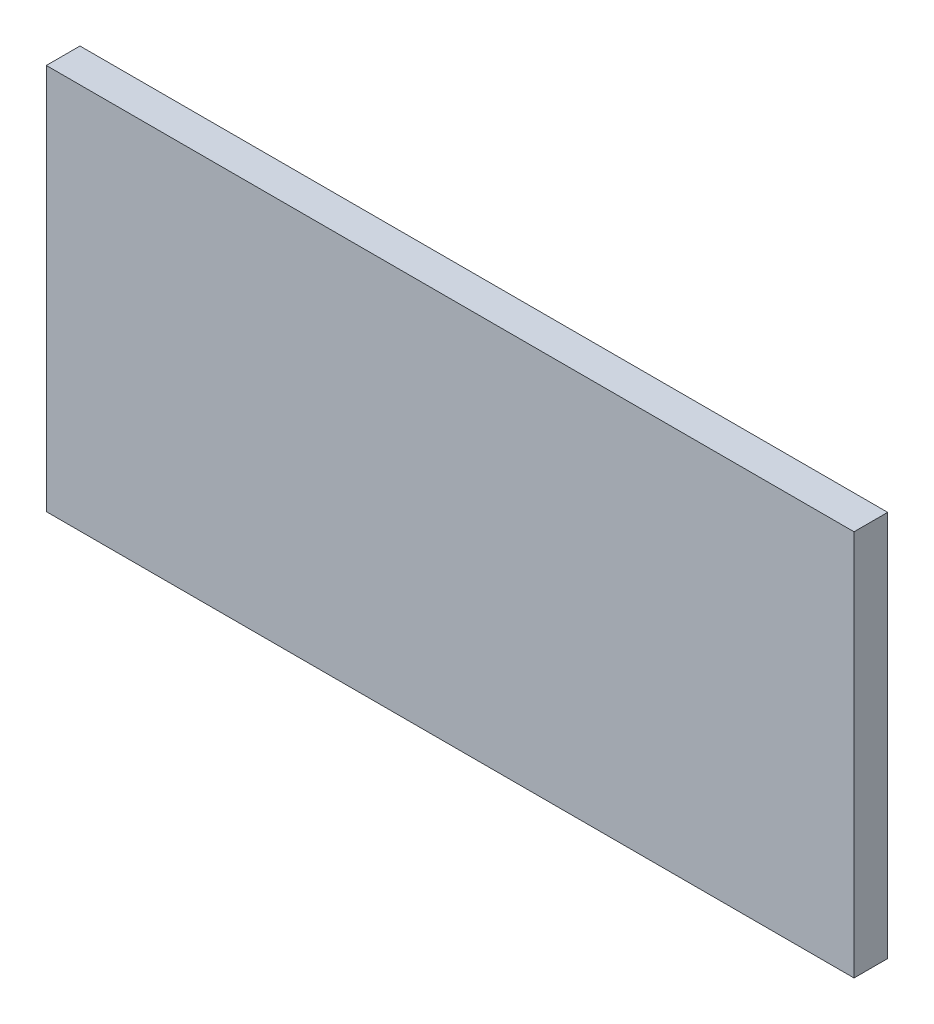
ISO-10303-21;
HEADER;
FILE_DESCRIPTION(('STEP AP214'),'2;1');
FILE_NAME('part.step','',(''),(''),'','','');
FILE_SCHEMA(('AUTOMOTIVE_DESIGN { 1 0 10303 214 1 1 1 1 }'));
ENDSEC;
DATA;
#1=APPLICATION_CONTEXT('core data for automotive mechanical design processes');
#2=APPLICATION_PROTOCOL_DEFINITION('international standard','automotive_design',2000,#1);
#3=PRODUCT_CONTEXT('',#1,'mechanical');
#4=PRODUCT('Part','Part','',(#3));
#5=PRODUCT_RELATED_PRODUCT_CATEGORY('part','',(#4));
#6=PRODUCT_DEFINITION_FORMATION('','',#4);
#7=PRODUCT_DEFINITION_CONTEXT('part definition',#1,'design');
#8=PRODUCT_DEFINITION('design','',#6,#7);
#9=PRODUCT_DEFINITION_SHAPE('','',#8);
#10=(LENGTH_UNIT() NAMED_UNIT(*) SI_UNIT(.MILLI.,.METRE.));
#11=(NAMED_UNIT(*) PLANE_ANGLE_UNIT() SI_UNIT($,.RADIAN.));
#12=(NAMED_UNIT(*) SI_UNIT($,.STERADIAN.) SOLID_ANGLE_UNIT());
#13=UNCERTAINTY_MEASURE_WITH_UNIT(LENGTH_MEASURE(1.E-05),#10,'distance_accuracy_value','');
#14=(GEOMETRIC_REPRESENTATION_CONTEXT(3) GLOBAL_UNCERTAINTY_ASSIGNED_CONTEXT((#13)) GLOBAL_UNIT_ASSIGNED_CONTEXT((#10,
#11,#12)) REPRESENTATION_CONTEXT('',''));
#15=CARTESIAN_POINT('',(0.,0.,0.));
#16=DIRECTION('',(0.,0.,1.));
#17=DIRECTION('',(1.,0.,0.));
#18=AXIS2_PLACEMENT_3D('',#15,#16,#17);
#19=CARTESIAN_POINT('',(0.,0.,10.));
#20=DIRECTION('',(1.,0.,0.));
#21=DIRECTION('',(0.,0.,-1.));
#22=AXIS2_PLACEMENT_3D('',#19,#20,#21);
#23=PLANE('',#22);
#24=DIRECTION('',(0.,-1.,0.));
#25=VECTOR('',#24,1.);
#26=CARTESIAN_POINT('',(0.,0.,0.));
#27=LINE('',#26,#25);
#28=CARTESIAN_POINT('',(0.,114.83,0.));
#29=VERTEX_POINT('',#28);
#30=CARTESIAN_POINT('',(0.,0.,0.));
#31=VERTEX_POINT('',#30);
#32=EDGE_CURVE('E102',#29,#31,#27,.T.);
#33=ORIENTED_EDGE('',*,*,#32,.T.);
#34=DIRECTION('',(0.,0.,-1.));
#35=VECTOR('',#34,1.);
#36=CARTESIAN_POINT('',(0.,0.,10.));
#37=LINE('',#36,#35);
#38=CARTESIAN_POINT('',(0.,0.,10.));
#39=VERTEX_POINT('',#38);
#40=EDGE_CURVE('E11',#39,#31,#37,.T.);
#41=ORIENTED_EDGE('',*,*,#40,.F.);
#42=DIRECTION('',(0.,-1.,0.));
#43=VECTOR('',#42,1.);
#44=CARTESIAN_POINT('',(0.,0.,10.));
#45=LINE('',#44,#43);
#46=CARTESIAN_POINT('',(0.,114.83,10.));
#47=VERTEX_POINT('',#46);
#48=EDGE_CURVE('E90',#47,#39,#45,.T.);
#49=ORIENTED_EDGE('',*,*,#48,.F.);
#50=DIRECTION('',(0.,0.,-1.));
#51=VECTOR('',#50,1.);
#52=CARTESIAN_POINT('',(0.,114.83,10.));
#53=LINE('',#52,#51);
#54=EDGE_CURVE('E98',#47,#29,#53,.T.);
#55=ORIENTED_EDGE('',*,*,#54,.T.);
#56=EDGE_LOOP('',(#33,#41,#49,#55));
#57=FACE_BOUND('',#56,.T.);
#58=ADVANCED_FACE('F39',(#57),#23,.F.);
#59=CARTESIAN_POINT('',(0.,0.,10.));
#60=DIRECTION('',(0.,1.,0.));
#61=DIRECTION('',(0.,0.,1.));
#62=AXIS2_PLACEMENT_3D('',#59,#60,#61);
#63=PLANE('',#62);
#64=DIRECTION('',(1.,0.,0.));
#65=VECTOR('',#64,1.);
#66=CARTESIAN_POINT('',(0.,0.,0.));
#67=LINE('',#66,#65);
#68=CARTESIAN_POINT('',(240.,0.,0.));
#69=VERTEX_POINT('',#68);
#70=EDGE_CURVE('E94',#31,#69,#67,.T.);
#71=ORIENTED_EDGE('',*,*,#70,.T.);
#72=DIRECTION('',(0.,0.,-1.));
#73=VECTOR('',#72,1.);
#74=CARTESIAN_POINT('',(240.,0.,10.));
#75=LINE('',#74,#73);
#76=CARTESIAN_POINT('',(240.,0.,10.));
#77=VERTEX_POINT('',#76);
#78=EDGE_CURVE('E47',#77,#69,#75,.T.);
#79=ORIENTED_EDGE('',*,*,#78,.F.);
#80=DIRECTION('',(1.,0.,0.));
#81=VECTOR('',#80,1.);
#82=CARTESIAN_POINT('',(0.,0.,10.));
#83=LINE('',#82,#81);
#84=EDGE_CURVE('E85',#39,#77,#83,.T.);
#85=ORIENTED_EDGE('',*,*,#84,.F.);
#86=ORIENTED_EDGE('',*,*,#40,.T.);
#87=EDGE_LOOP('',(#71,#79,#85,#86));
#88=FACE_BOUND('',#87,.T.);
#89=ADVANCED_FACE('F93',(#88),#63,.F.);
#90=CARTESIAN_POINT('',(240.,0.,10.));
#91=DIRECTION('',(-1.,0.,0.));
#92=DIRECTION('',(0.,0.,1.));
#93=AXIS2_PLACEMENT_3D('',#90,#91,#92);
#94=PLANE('',#93);
#95=DIRECTION('',(0.,1.,0.));
#96=VECTOR('',#95,1.);
#97=CARTESIAN_POINT('',(240.,0.,0.));
#98=LINE('',#97,#96);
#99=CARTESIAN_POINT('',(240.,114.83,0.));
#100=VERTEX_POINT('',#99);
#101=EDGE_CURVE('E72',#69,#100,#98,.T.);
#102=ORIENTED_EDGE('',*,*,#101,.T.);
#103=DIRECTION('',(0.,0.,-1.));
#104=VECTOR('',#103,1.);
#105=CARTESIAN_POINT('',(240.,114.83,10.));
#106=LINE('',#105,#104);
#107=CARTESIAN_POINT('',(240.,114.83,10.));
#108=VERTEX_POINT('',#107);
#109=EDGE_CURVE('E95',#108,#100,#106,.T.);
#110=ORIENTED_EDGE('',*,*,#109,.F.);
#111=DIRECTION('',(0.,1.,0.));
#112=VECTOR('',#111,1.);
#113=CARTESIAN_POINT('',(240.,0.,10.));
#114=LINE('',#113,#112);
#115=EDGE_CURVE('E88',#77,#108,#114,.T.);
#116=ORIENTED_EDGE('',*,*,#115,.F.);
#117=ORIENTED_EDGE('',*,*,#78,.T.);
#118=EDGE_LOOP('',(#102,#110,#116,#117));
#119=FACE_BOUND('',#118,.T.);
#120=ADVANCED_FACE('F96',(#119),#94,.F.);
#121=CARTESIAN_POINT('',(0.,114.83,10.));
#122=DIRECTION('',(0.,-1.,0.));
#123=DIRECTION('',(0.,0.,-1.));
#124=AXIS2_PLACEMENT_3D('',#121,#122,#123);
#125=PLANE('',#124);
#126=DIRECTION('',(-1.,0.,0.));
#127=VECTOR('',#126,1.);
#128=CARTESIAN_POINT('',(0.,114.83,0.));
#129=LINE('',#128,#127);
#130=EDGE_CURVE('E78',#100,#29,#129,.T.);
#131=ORIENTED_EDGE('',*,*,#130,.T.);
#132=ORIENTED_EDGE('',*,*,#54,.F.);
#133=DIRECTION('',(-1.,0.,0.));
#134=VECTOR('',#133,1.);
#135=CARTESIAN_POINT('',(0.,114.83,10.));
#136=LINE('',#135,#134);
#137=EDGE_CURVE('E55',#108,#47,#136,.T.);
#138=ORIENTED_EDGE('',*,*,#137,.F.);
#139=ORIENTED_EDGE('',*,*,#109,.T.);
#140=EDGE_LOOP('',(#131,#132,#138,#139));
#141=FACE_BOUND('',#140,.T.);
#142=ADVANCED_FACE('F109',(#141),#125,.F.);
#143=CARTESIAN_POINT('',(0.,0.,10.));
#144=DIRECTION('',(0.,0.,-1.));
#145=DIRECTION('',(-1.,0.,0.));
#146=AXIS2_PLACEMENT_3D('',#143,#144,#145);
#147=PLANE('',#146);
#148=ORIENTED_EDGE('',*,*,#48,.T.);
#149=ORIENTED_EDGE('',*,*,#84,.T.);
#150=ORIENTED_EDGE('',*,*,#115,.T.);
#151=ORIENTED_EDGE('',*,*,#137,.T.);
#152=EDGE_LOOP('',(#148,#149,#150,#151));
#153=FACE_BOUND('',#152,.T.);
#154=ADVANCED_FACE('F86',(#153),#147,.F.);
#155=CARTESIAN_POINT('',(0.,0.,0.));
#156=DIRECTION('',(0.,0.,-1.));
#157=DIRECTION('',(-1.,0.,0.));
#158=AXIS2_PLACEMENT_3D('',#155,#156,#157);
#159=PLANE('',#158);
#160=ORIENTED_EDGE('',*,*,#32,.F.);
#161=ORIENTED_EDGE('',*,*,#130,.F.);
#162=ORIENTED_EDGE('',*,*,#101,.F.);
#163=ORIENTED_EDGE('',*,*,#70,.F.);
#164=EDGE_LOOP('',(#160,#161,#162,#163));
#165=FACE_BOUND('',#164,.T.);
#166=ADVANCED_FACE('F112',(#165),#159,.T.);
#167=CLOSED_SHELL('',(#58,#89,#120,#142,#154,#166));
#168=MANIFOLD_SOLID_BREP('B2',#167);
#169=ADVANCED_BREP_SHAPE_REPRESENTATION('',(#18,#168),#14);
#170=SHAPE_DEFINITION_REPRESENTATION(#9,#169);
ENDSEC;
END-ISO-10303-21;
